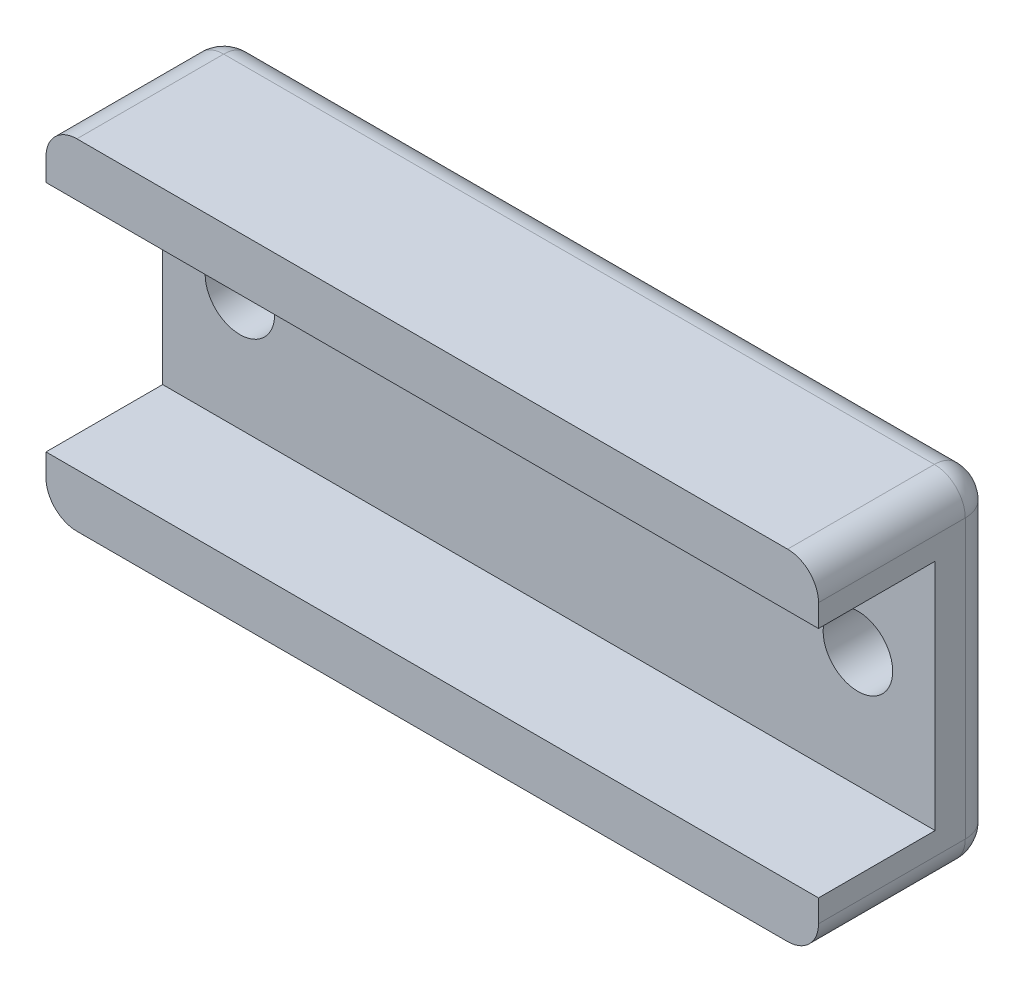
ISO-10303-21;
HEADER;
FILE_DESCRIPTION(('STEP AP214'),'2;1');
FILE_NAME('part.step','',(''),(''),'','','');
FILE_SCHEMA(('AUTOMOTIVE_DESIGN { 1 0 10303 214 1 1 1 1 }'));
ENDSEC;
DATA;
#1=APPLICATION_CONTEXT('core data for automotive mechanical design processes');
#2=APPLICATION_PROTOCOL_DEFINITION('international standard','automotive_design',2000,#1);
#3=PRODUCT_CONTEXT('',#1,'mechanical');
#4=PRODUCT('Part','Part','',(#3));
#5=PRODUCT_RELATED_PRODUCT_CATEGORY('part','',(#4));
#6=PRODUCT_DEFINITION_FORMATION('','',#4);
#7=PRODUCT_DEFINITION_CONTEXT('part definition',#1,'design');
#8=PRODUCT_DEFINITION('design','',#6,#7);
#9=PRODUCT_DEFINITION_SHAPE('','',#8);
#10=(LENGTH_UNIT() NAMED_UNIT(*) SI_UNIT(.MILLI.,.METRE.));
#11=(NAMED_UNIT(*) PLANE_ANGLE_UNIT() SI_UNIT($,.RADIAN.));
#12=(NAMED_UNIT(*) SI_UNIT($,.STERADIAN.) SOLID_ANGLE_UNIT());
#13=UNCERTAINTY_MEASURE_WITH_UNIT(LENGTH_MEASURE(1.E-05),#10,'distance_accuracy_value','');
#14=(GEOMETRIC_REPRESENTATION_CONTEXT(3) GLOBAL_UNCERTAINTY_ASSIGNED_CONTEXT((#13)) GLOBAL_UNIT_ASSIGNED_CONTEXT((#10,
#11,#12)) REPRESENTATION_CONTEXT('',''));
#15=CARTESIAN_POINT('',(0.,0.,0.));
#16=DIRECTION('',(0.,0.,1.));
#17=DIRECTION('',(1.,0.,0.));
#18=AXIS2_PLACEMENT_3D('',#15,#16,#17);
#19=CARTESIAN_POINT('',(0.,0.,23.));
#20=DIRECTION('',(1.,0.,0.));
#21=DIRECTION('',(0.,1.,0.));
#22=AXIS2_PLACEMENT_3D('',#19,#20,#21);
#23=PLANE('',#22);
#24=DIRECTION('',(0.,-1.,0.));
#25=VECTOR('',#24,1.);
#26=CARTESIAN_POINT('',(0.,0.,2.));
#27=LINE('',#26,#25);
#28=CARTESIAN_POINT('',(0.,-2.,2.));
#29=VERTEX_POINT('',#28);
#30=CARTESIAN_POINT('',(0.,-20.,2.));
#31=VERTEX_POINT('',#30);
#32=EDGE_CURVE('E228',#29,#31,#27,.T.);
#33=ORIENTED_EDGE('',*,*,#32,.T.);
#34=DIRECTION('',(0.,0.,-1.));
#35=VECTOR('',#34,1.);
#36=CARTESIAN_POINT('',(0.,-20.,23.));
#37=LINE('',#36,#35);
#38=CARTESIAN_POINT('',(0.,-20.,11.5));
#39=VERTEX_POINT('',#38);
#40=EDGE_CURVE('E162',#31,#39,#37,.F.);
#41=ORIENTED_EDGE('',*,*,#40,.T.);
#42=DIRECTION('',(0.,-1.,0.));
#43=VECTOR('',#42,1.);
#44=CARTESIAN_POINT('',(0.,27.,11.5));
#45=LINE('',#44,#43);
#46=CARTESIAN_POINT('',(0.,-18.55,11.5));
#47=VERTEX_POINT('',#46);
#48=EDGE_CURVE('E147',#47,#39,#45,.T.);
#49=ORIENTED_EDGE('',*,*,#48,.F.);
#50=DIRECTION('',(0.,0.,-1.));
#51=VECTOR('',#50,1.);
#52=CARTESIAN_POINT('',(0.,-18.55,23.));
#53=LINE('',#52,#51);
#54=CARTESIAN_POINT('',(0.,-18.55,3.95));
#55=VERTEX_POINT('',#54);
#56=EDGE_CURVE('E159',#47,#55,#53,.T.);
#57=ORIENTED_EDGE('',*,*,#56,.T.);
#58=DIRECTION('',(0.,-1.,0.));
#59=VECTOR('',#58,1.);
#60=CARTESIAN_POINT('',(0.,0.,3.95));
#61=LINE('',#60,#59);
#62=CARTESIAN_POINT('',(0.,-3.45,3.95));
#63=VERTEX_POINT('',#62);
#64=EDGE_CURVE('E176',#63,#55,#61,.T.);
#65=ORIENTED_EDGE('',*,*,#64,.F.);
#66=DIRECTION('',(0.,0.,-1.));
#67=VECTOR('',#66,1.);
#68=CARTESIAN_POINT('',(0.,-3.45,23.));
#69=LINE('',#68,#67);
#70=CARTESIAN_POINT('',(0.,-3.45,11.5));
#71=VERTEX_POINT('',#70);
#72=EDGE_CURVE('E171',#71,#63,#69,.T.);
#73=ORIENTED_EDGE('',*,*,#72,.F.);
#74=CARTESIAN_POINT('',(0.,-2.,11.5));
#75=VERTEX_POINT('',#74);
#76=EDGE_CURVE('E163',#75,#71,#45,.T.);
#77=ORIENTED_EDGE('',*,*,#76,.F.);
#78=DIRECTION('',(0.,0.,-1.));
#79=VECTOR('',#78,1.);
#80=CARTESIAN_POINT('',(0.,-2.,23.));
#81=LINE('',#80,#79);
#82=EDGE_CURVE('E226',#75,#29,#81,.T.);
#83=ORIENTED_EDGE('',*,*,#82,.T.);
#84=EDGE_LOOP('',(#33,#41,#49,#57,#65,#73,#77,#83));
#85=FACE_BOUND('',#84,.T.);
#86=ADVANCED_FACE('F40',(#85),#23,.F.);
#87=CARTESIAN_POINT('',(0.,-22.,23.));
#88=DIRECTION('',(0.,1.,0.));
#89=DIRECTION('',(0.,0.,1.));
#90=AXIS2_PLACEMENT_3D('',#87,#88,#89);
#91=PLANE('',#90);
#92=DIRECTION('',(1.,0.,0.));
#93=VECTOR('',#92,1.);
#94=CARTESIAN_POINT('',(0.,-22.,2.));
#95=LINE('',#94,#93);
#96=CARTESIAN_POINT('',(2.,-22.,2.));
#97=VERTEX_POINT('',#96);
#98=CARTESIAN_POINT('',(48.,-22.,2.));
#99=VERTEX_POINT('',#98);
#100=EDGE_CURVE('E195',#97,#99,#95,.T.);
#101=ORIENTED_EDGE('',*,*,#100,.T.);
#102=DIRECTION('',(0.,0.,-1.));
#103=VECTOR('',#102,1.);
#104=CARTESIAN_POINT('',(48.,-22.,23.));
#105=LINE('',#104,#103);
#106=CARTESIAN_POINT('',(48.,-22.,11.5));
#107=VERTEX_POINT('',#106);
#108=EDGE_CURVE('E208',#99,#107,#105,.F.);
#109=ORIENTED_EDGE('',*,*,#108,.T.);
#110=DIRECTION('',(1.,0.,0.));
#111=VECTOR('',#110,1.);
#112=CARTESIAN_POINT('',(0.,-22.,11.5));
#113=LINE('',#112,#111);
#114=CARTESIAN_POINT('',(2.,-22.,11.5));
#115=VERTEX_POINT('',#114);
#116=EDGE_CURVE('E164',#115,#107,#113,.T.);
#117=ORIENTED_EDGE('',*,*,#116,.F.);
#118=DIRECTION('',(0.,0.,-1.));
#119=VECTOR('',#118,1.);
#120=CARTESIAN_POINT('',(2.,-22.,23.));
#121=LINE('',#120,#119);
#122=EDGE_CURVE('E205',#115,#97,#121,.T.);
#123=ORIENTED_EDGE('',*,*,#122,.T.);
#124=EDGE_LOOP('',(#101,#109,#117,#123));
#125=FACE_BOUND('',#124,.T.);
#126=ADVANCED_FACE('F325',(#125),#91,.F.);
#127=CARTESIAN_POINT('',(50.,0.,23.));
#128=DIRECTION('',(-1.,0.,0.));
#129=DIRECTION('',(0.,0.,1.));
#130=AXIS2_PLACEMENT_3D('',#127,#128,#129);
#131=PLANE('',#130);
#132=DIRECTION('',(0.,-1.,0.));
#133=VECTOR('',#132,1.);
#134=CARTESIAN_POINT('',(50.,27.,11.5));
#135=LINE('',#134,#133);
#136=CARTESIAN_POINT('',(50.,-18.55,11.5));
#137=VERTEX_POINT('',#136);
#138=CARTESIAN_POINT('',(50.,-20.,11.5));
#139=VERTEX_POINT('',#138);
#140=EDGE_CURVE('E150',#137,#139,#135,.T.);
#141=ORIENTED_EDGE('',*,*,#140,.T.);
#142=DIRECTION('',(0.,0.,-1.));
#143=VECTOR('',#142,1.);
#144=CARTESIAN_POINT('',(50.,-20.,23.));
#145=LINE('',#144,#143);
#146=CARTESIAN_POINT('',(50.,-20.,2.));
#147=VERTEX_POINT('',#146);
#148=EDGE_CURVE('E202',#139,#147,#145,.T.);
#149=ORIENTED_EDGE('',*,*,#148,.T.);
#150=DIRECTION('',(0.,1.,0.));
#151=VECTOR('',#150,1.);
#152=CARTESIAN_POINT('',(50.,0.,2.));
#153=LINE('',#152,#151);
#154=CARTESIAN_POINT('',(50.,-2.,2.));
#155=VERTEX_POINT('',#154);
#156=EDGE_CURVE('E200',#147,#155,#153,.T.);
#157=ORIENTED_EDGE('',*,*,#156,.T.);
#158=DIRECTION('',(0.,0.,-1.));
#159=VECTOR('',#158,1.);
#160=CARTESIAN_POINT('',(50.,-2.,23.));
#161=LINE('',#160,#159);
#162=CARTESIAN_POINT('',(50.,-2.,11.5));
#163=VERTEX_POINT('',#162);
#164=EDGE_CURVE('E198',#155,#163,#161,.F.);
#165=ORIENTED_EDGE('',*,*,#164,.T.);
#166=CARTESIAN_POINT('',(50.,-3.45,11.5));
#167=VERTEX_POINT('',#166);
#168=EDGE_CURVE('E155',#163,#167,#135,.T.);
#169=ORIENTED_EDGE('',*,*,#168,.T.);
#170=DIRECTION('',(0.,0.,-1.));
#171=VECTOR('',#170,1.);
#172=CARTESIAN_POINT('',(50.,-3.45,19.05));
#173=LINE('',#172,#171);
#174=CARTESIAN_POINT('',(50.,-3.45,3.95));
#175=VERTEX_POINT('',#174);
#176=EDGE_CURVE('E281',#167,#175,#173,.T.);
#177=ORIENTED_EDGE('',*,*,#176,.T.);
#178=DIRECTION('',(0.,-1.,0.));
#179=VECTOR('',#178,1.);
#180=CARTESIAN_POINT('',(50.,-3.45,3.95));
#181=LINE('',#180,#179);
#182=CARTESIAN_POINT('',(50.,-18.55,3.95));
#183=VERTEX_POINT('',#182);
#184=EDGE_CURVE('E278',#175,#183,#181,.T.);
#185=ORIENTED_EDGE('',*,*,#184,.T.);
#186=DIRECTION('',(0.,0.,-1.));
#187=VECTOR('',#186,1.);
#188=CARTESIAN_POINT('',(50.,-18.55,19.05));
#189=LINE('',#188,#187);
#190=EDGE_CURVE('E186',#137,#183,#189,.T.);
#191=ORIENTED_EDGE('',*,*,#190,.F.);
#192=EDGE_LOOP('',(#141,#149,#157,#165,#169,#177,#185,#191));
#193=FACE_BOUND('',#192,.T.);
#194=ADVANCED_FACE('F332',(#193),#131,.F.);
#195=CARTESIAN_POINT('',(0.,0.,23.));
#196=DIRECTION('',(0.,-1.,0.));
#197=DIRECTION('',(0.,0.,-1.));
#198=AXIS2_PLACEMENT_3D('',#195,#196,#197);
#199=PLANE('',#198);
#200=DIRECTION('',(1.,0.,0.));
#201=VECTOR('',#200,1.);
#202=CARTESIAN_POINT('',(0.,0.,11.5));
#203=LINE('',#202,#201);
#204=CARTESIAN_POINT('',(2.,0.,11.5));
#205=VERTEX_POINT('',#204);
#206=CARTESIAN_POINT('',(48.,0.,11.5));
#207=VERTEX_POINT('',#206);
#208=EDGE_CURVE('E154',#205,#207,#203,.T.);
#209=ORIENTED_EDGE('',*,*,#208,.T.);
#210=DIRECTION('',(0.,0.,-1.));
#211=VECTOR('',#210,1.);
#212=CARTESIAN_POINT('',(48.,0.,23.));
#213=LINE('',#212,#211);
#214=CARTESIAN_POINT('',(48.,0.,2.));
#215=VERTEX_POINT('',#214);
#216=EDGE_CURVE('E232',#207,#215,#213,.T.);
#217=ORIENTED_EDGE('',*,*,#216,.T.);
#218=DIRECTION('',(-1.,0.,0.));
#219=VECTOR('',#218,1.);
#220=CARTESIAN_POINT('',(0.,0.,2.));
#221=LINE('',#220,#219);
#222=CARTESIAN_POINT('',(2.,0.,2.));
#223=VERTEX_POINT('',#222);
#224=EDGE_CURVE('E174',#215,#223,#221,.T.);
#225=ORIENTED_EDGE('',*,*,#224,.T.);
#226=DIRECTION('',(0.,0.,-1.));
#227=VECTOR('',#226,1.);
#228=CARTESIAN_POINT('',(2.,0.,23.));
#229=LINE('',#228,#227);
#230=EDGE_CURVE('E62',#223,#205,#229,.F.);
#231=ORIENTED_EDGE('',*,*,#230,.T.);
#232=EDGE_LOOP('',(#209,#217,#225,#231));
#233=FACE_BOUND('',#232,.T.);
#234=ADVANCED_FACE('F301',(#233),#199,.F.);
#235=CARTESIAN_POINT('',(0.,0.,0.));
#236=DIRECTION('',(0.,0.,1.));
#237=DIRECTION('',(1.,0.,0.));
#238=AXIS2_PLACEMENT_3D('',#235,#236,#237);
#239=PLANE('',#238);
#240=CARTESIAN_POINT('',(45.,-11.,0.));
#241=DIRECTION('',(0.,0.,-1.));
#242=DIRECTION('',(-1.,0.,0.));
#243=AXIS2_PLACEMENT_3D('',#240,#241,#242);
#244=CIRCLE('',#243,2.25);
#245=CARTESIAN_POINT('',(42.75,-11.,0.));
#246=VERTEX_POINT('',#245);
#247=EDGE_CURVE('E184',#246,#246,#244,.T.);
#248=ORIENTED_EDGE('',*,*,#247,.F.);
#249=EDGE_LOOP('',(#248));
#250=FACE_BOUND('',#249,.T.);
#251=CARTESIAN_POINT('',(5.,-11.,0.));
#252=DIRECTION('',(0.,0.,-1.));
#253=DIRECTION('',(-1.,0.,0.));
#254=AXIS2_PLACEMENT_3D('',#251,#252,#253);
#255=CIRCLE('',#254,2.25);
#256=CARTESIAN_POINT('',(2.75,-11.,0.));
#257=VERTEX_POINT('',#256);
#258=EDGE_CURVE('E272',#257,#257,#255,.T.);
#259=ORIENTED_EDGE('',*,*,#258,.F.);
#260=EDGE_LOOP('',(#259));
#261=FACE_BOUND('',#260,.T.);
#262=DIRECTION('',(-1.,0.,0.));
#263=VECTOR('',#262,1.);
#264=CARTESIAN_POINT('',(0.,-2.,0.));
#265=LINE('',#264,#263);
#266=CARTESIAN_POINT('',(2.,-2.,0.));
#267=VERTEX_POINT('',#266);
#268=CARTESIAN_POINT('',(48.,-2.,0.));
#269=VERTEX_POINT('',#268);
#270=EDGE_CURVE('E192',#267,#269,#265,.F.);
#271=ORIENTED_EDGE('',*,*,#270,.T.);
#272=DIRECTION('',(0.,1.,0.));
#273=VECTOR('',#272,1.);
#274=CARTESIAN_POINT('',(48.,0.,0.));
#275=LINE('',#274,#273);
#276=CARTESIAN_POINT('',(48.,-20.,0.));
#277=VERTEX_POINT('',#276);
#278=EDGE_CURVE('E220',#269,#277,#275,.F.);
#279=ORIENTED_EDGE('',*,*,#278,.T.);
#280=DIRECTION('',(1.,0.,0.));
#281=VECTOR('',#280,1.);
#282=CARTESIAN_POINT('',(0.,-20.,0.));
#283=LINE('',#282,#281);
#284=CARTESIAN_POINT('',(2.,-20.,0.));
#285=VERTEX_POINT('',#284);
#286=EDGE_CURVE('E189',#277,#285,#283,.F.);
#287=ORIENTED_EDGE('',*,*,#286,.T.);
#288=DIRECTION('',(0.,-1.,0.));
#289=VECTOR('',#288,1.);
#290=CARTESIAN_POINT('',(2.,0.,0.));
#291=LINE('',#290,#289);
#292=EDGE_CURVE('E218',#285,#267,#291,.F.);
#293=ORIENTED_EDGE('',*,*,#292,.T.);
#294=EDGE_LOOP('',(#271,#279,#287,#293));
#295=FACE_BOUND('',#294,.T.);
#296=ADVANCED_FACE('F307',(#250,#261,#295),#239,.F.);
#297=CARTESIAN_POINT('',(-27.,-18.55,19.05));
#298=DIRECTION('',(0.,-1.,0.));
#299=DIRECTION('',(0.,0.,-1.));
#300=AXIS2_PLACEMENT_3D('',#297,#298,#299);
#301=PLANE('',#300);
#302=ORIENTED_EDGE('',*,*,#56,.F.);
#303=DIRECTION('',(1.,0.,0.));
#304=VECTOR('',#303,1.);
#305=CARTESIAN_POINT('',(-27.,-18.55,11.5));
#306=LINE('',#305,#304);
#307=EDGE_CURVE('E143',#47,#137,#306,.T.);
#308=ORIENTED_EDGE('',*,*,#307,.T.);
#309=ORIENTED_EDGE('',*,*,#190,.T.);
#310=DIRECTION('',(1.,0.,0.));
#311=VECTOR('',#310,1.);
#312=CARTESIAN_POINT('',(-27.,-18.55,3.95));
#313=LINE('',#312,#311);
#314=EDGE_CURVE('E169',#55,#183,#313,.T.);
#315=ORIENTED_EDGE('',*,*,#314,.F.);
#316=EDGE_LOOP('',(#302,#308,#309,#315));
#317=FACE_BOUND('',#316,.T.);
#318=ADVANCED_FACE('F167',(#317),#301,.F.);
#319=CARTESIAN_POINT('',(-27.,-3.45,19.05));
#320=DIRECTION('',(0.,-1.,0.));
#321=DIRECTION('',(0.,0.,-1.));
#322=AXIS2_PLACEMENT_3D('',#319,#320,#321);
#323=PLANE('',#322);
#324=DIRECTION('',(1.,0.,0.));
#325=VECTOR('',#324,1.);
#326=CARTESIAN_POINT('',(-27.,-3.45,11.5));
#327=LINE('',#326,#325);
#328=EDGE_CURVE('E170',#71,#167,#327,.T.);
#329=ORIENTED_EDGE('',*,*,#328,.F.);
#330=ORIENTED_EDGE('',*,*,#72,.T.);
#331=DIRECTION('',(1.,0.,0.));
#332=VECTOR('',#331,1.);
#333=CARTESIAN_POINT('',(-27.,-3.45,3.95));
#334=LINE('',#333,#332);
#335=EDGE_CURVE('E283',#63,#175,#334,.T.);
#336=ORIENTED_EDGE('',*,*,#335,.T.);
#337=ORIENTED_EDGE('',*,*,#176,.F.);
#338=EDGE_LOOP('',(#329,#330,#336,#337));
#339=FACE_BOUND('',#338,.T.);
#340=ADVANCED_FACE('F292',(#339),#323,.T.);
#341=CARTESIAN_POINT('',(-27.,-3.45,3.95));
#342=DIRECTION('',(0.,0.,1.));
#343=DIRECTION('',(0.,-1.,0.));
#344=AXIS2_PLACEMENT_3D('',#341,#342,#343);
#345=PLANE('',#344);
#346=CARTESIAN_POINT('',(45.,-11.,3.95));
#347=DIRECTION('',(0.,0.,1.));
#348=DIRECTION('',(0.,-1.,0.));
#349=AXIS2_PLACEMENT_3D('',#346,#347,#348);
#350=CIRCLE('',#349,2.25);
#351=CARTESIAN_POINT('',(45.,-13.25,3.95));
#352=VERTEX_POINT('',#351);
#353=EDGE_CURVE('E183',#352,#352,#350,.T.);
#354=ORIENTED_EDGE('',*,*,#353,.F.);
#355=EDGE_LOOP('',(#354));
#356=FACE_BOUND('',#355,.T.);
#357=CARTESIAN_POINT('',(5.,-11.,3.95));
#358=DIRECTION('',(0.,0.,1.));
#359=DIRECTION('',(0.,-1.,0.));
#360=AXIS2_PLACEMENT_3D('',#357,#358,#359);
#361=CIRCLE('',#360,2.25);
#362=CARTESIAN_POINT('',(5.,-13.25,3.95));
#363=VERTEX_POINT('',#362);
#364=EDGE_CURVE('E180',#363,#363,#361,.T.);
#365=ORIENTED_EDGE('',*,*,#364,.F.);
#366=EDGE_LOOP('',(#365));
#367=FACE_BOUND('',#366,.T.);
#368=ORIENTED_EDGE('',*,*,#64,.T.);
#369=ORIENTED_EDGE('',*,*,#314,.T.);
#370=ORIENTED_EDGE('',*,*,#184,.F.);
#371=ORIENTED_EDGE('',*,*,#335,.F.);
#372=EDGE_LOOP('',(#368,#369,#370,#371));
#373=FACE_BOUND('',#372,.T.);
#374=ADVANCED_FACE('F288',(#356,#367,#373),#345,.T.);
#375=CARTESIAN_POINT('',(5.,-11.,49.));
#376=DIRECTION('',(0.,0.,-1.));
#377=DIRECTION('',(-1.,0.,0.));
#378=AXIS2_PLACEMENT_3D('',#375,#376,#377);
#379=CYLINDRICAL_SURFACE('',#378,2.25);
#380=ORIENTED_EDGE('',*,*,#364,.T.);
#381=EDGE_LOOP('',(#380));
#382=FACE_BOUND('',#381,.T.);
#383=ORIENTED_EDGE('',*,*,#258,.T.);
#384=EDGE_LOOP('',(#383));
#385=FACE_BOUND('',#384,.T.);
#386=ADVANCED_FACE('F423',(#382,#385),#379,.F.);
#387=CARTESIAN_POINT('',(45.,-11.,49.));
#388=DIRECTION('',(0.,0.,-1.));
#389=DIRECTION('',(-1.,0.,0.));
#390=AXIS2_PLACEMENT_3D('',#387,#388,#389);
#391=CYLINDRICAL_SURFACE('',#390,2.25);
#392=ORIENTED_EDGE('',*,*,#353,.T.);
#393=EDGE_LOOP('',(#392));
#394=FACE_BOUND('',#393,.T.);
#395=ORIENTED_EDGE('',*,*,#247,.T.);
#396=EDGE_LOOP('',(#395));
#397=FACE_BOUND('',#396,.T.);
#398=ADVANCED_FACE('F416',(#394,#397),#391,.F.);
#399=CARTESIAN_POINT('',(0.,27.,11.5));
#400=DIRECTION('',(0.,0.,-1.));
#401=DIRECTION('',(-1.,0.,0.));
#402=AXIS2_PLACEMENT_3D('',#399,#400,#401);
#403=PLANE('',#402);
#404=ORIENTED_EDGE('',*,*,#168,.F.);
#405=CARTESIAN_POINT('',(48.,-2.,11.5));
#406=DIRECTION('',(0.,0.,-1.));
#407=DIRECTION('',(-1.,0.,0.));
#408=AXIS2_PLACEMENT_3D('',#405,#406,#407);
#409=CIRCLE('',#408,2.);
#410=EDGE_CURVE('E11',#163,#207,#409,.F.);
#411=ORIENTED_EDGE('',*,*,#410,.T.);
#412=ORIENTED_EDGE('',*,*,#208,.F.);
#413=CARTESIAN_POINT('',(2.,-2.,11.5));
#414=DIRECTION('',(0.,0.,-1.));
#415=DIRECTION('',(-1.,0.,0.));
#416=AXIS2_PLACEMENT_3D('',#413,#414,#415);
#417=CIRCLE('',#416,2.);
#418=EDGE_CURVE('E49',#205,#75,#417,.F.);
#419=ORIENTED_EDGE('',*,*,#418,.T.);
#420=ORIENTED_EDGE('',*,*,#76,.T.);
#421=ORIENTED_EDGE('',*,*,#328,.T.);
#422=EDGE_LOOP('',(#404,#411,#412,#419,#420,#421));
#423=FACE_BOUND('',#422,.T.);
#424=ADVANCED_FACE('F265',(#423),#403,.F.);
#425=ORIENTED_EDGE('',*,*,#116,.T.);
#426=CARTESIAN_POINT('',(48.,-20.,11.5));
#427=DIRECTION('',(0.,0.,-1.));
#428=DIRECTION('',(-1.,0.,0.));
#429=AXIS2_PLACEMENT_3D('',#426,#427,#428);
#430=CIRCLE('',#429,2.);
#431=EDGE_CURVE('E212',#107,#139,#430,.F.);
#432=ORIENTED_EDGE('',*,*,#431,.T.);
#433=ORIENTED_EDGE('',*,*,#140,.F.);
#434=ORIENTED_EDGE('',*,*,#307,.F.);
#435=ORIENTED_EDGE('',*,*,#48,.T.);
#436=CARTESIAN_POINT('',(2.,-20.,11.5));
#437=DIRECTION('',(0.,0.,-1.));
#438=DIRECTION('',(-1.,0.,0.));
#439=AXIS2_PLACEMENT_3D('',#436,#437,#438);
#440=CIRCLE('',#439,2.);
#441=EDGE_CURVE('E210',#39,#115,#440,.F.);
#442=ORIENTED_EDGE('',*,*,#441,.T.);
#443=EDGE_LOOP('',(#425,#432,#433,#434,#435,#442));
#444=FACE_BOUND('',#443,.T.);
#445=ADVANCED_FACE('F146',(#444),#403,.F.);
#446=CARTESIAN_POINT('',(0.,-2.,2.));
#447=DIRECTION('',(-1.,0.,0.));
#448=DIRECTION('',(0.,0.,1.));
#449=AXIS2_PLACEMENT_3D('',#446,#447,#448);
#450=CYLINDRICAL_SURFACE('',#449,2.);
#451=ORIENTED_EDGE('',*,*,#224,.F.);
#452=CARTESIAN_POINT('',(48.,-2.,2.));
#453=DIRECTION('',(-1.,0.,0.));
#454=DIRECTION('',(0.,0.,1.));
#455=AXIS2_PLACEMENT_3D('',#452,#453,#454);
#456=CIRCLE('',#455,2.);
#457=EDGE_CURVE('E224',#215,#269,#456,.T.);
#458=ORIENTED_EDGE('',*,*,#457,.T.);
#459=ORIENTED_EDGE('',*,*,#270,.F.);
#460=CARTESIAN_POINT('',(2.,-2.,2.));
#461=DIRECTION('',(-1.,0.,0.));
#462=DIRECTION('',(0.,0.,1.));
#463=AXIS2_PLACEMENT_3D('',#460,#461,#462);
#464=CIRCLE('',#463,2.);
#465=EDGE_CURVE('E222',#267,#223,#464,.F.);
#466=ORIENTED_EDGE('',*,*,#465,.T.);
#467=EDGE_LOOP('',(#451,#458,#459,#466));
#468=FACE_BOUND('',#467,.T.);
#469=ADVANCED_FACE('F303',(#468),#450,.T.);
#470=CARTESIAN_POINT('',(0.,-20.,2.));
#471=DIRECTION('',(1.,0.,0.));
#472=DIRECTION('',(0.,0.,-1.));
#473=AXIS2_PLACEMENT_3D('',#470,#471,#472);
#474=CYLINDRICAL_SURFACE('',#473,2.);
#475=ORIENTED_EDGE('',*,*,#286,.F.);
#476=CARTESIAN_POINT('',(48.,-20.,2.));
#477=DIRECTION('',(1.,0.,0.));
#478=DIRECTION('',(0.,0.,-1.));
#479=AXIS2_PLACEMENT_3D('',#476,#477,#478);
#480=CIRCLE('',#479,2.);
#481=EDGE_CURVE('E216',#277,#99,#480,.F.);
#482=ORIENTED_EDGE('',*,*,#481,.T.);
#483=ORIENTED_EDGE('',*,*,#100,.F.);
#484=CARTESIAN_POINT('',(2.,-20.,2.));
#485=DIRECTION('',(1.,0.,0.));
#486=DIRECTION('',(0.,0.,-1.));
#487=AXIS2_PLACEMENT_3D('',#484,#485,#486);
#488=CIRCLE('',#487,2.);
#489=EDGE_CURVE('E214',#97,#285,#488,.T.);
#490=ORIENTED_EDGE('',*,*,#489,.T.);
#491=EDGE_LOOP('',(#475,#482,#483,#490));
#492=FACE_BOUND('',#491,.T.);
#493=ADVANCED_FACE('F322',(#492),#474,.T.);
#494=CARTESIAN_POINT('',(48.,-2.,23.));
#495=DIRECTION('',(0.,0.,-1.));
#496=DIRECTION('',(-1.,0.,0.));
#497=AXIS2_PLACEMENT_3D('',#494,#495,#496);
#498=CYLINDRICAL_SURFACE('',#497,2.);
#499=CARTESIAN_POINT('',(48.,-2.,2.));
#500=DIRECTION('',(0.,0.,-1.));
#501=DIRECTION('',(-1.,0.,0.));
#502=AXIS2_PLACEMENT_3D('',#499,#500,#501);
#503=CIRCLE('',#502,2.);
#504=EDGE_CURVE('E243',#215,#155,#503,.T.);
#505=ORIENTED_EDGE('',*,*,#504,.F.);
#506=ORIENTED_EDGE('',*,*,#216,.F.);
#507=ORIENTED_EDGE('',*,*,#410,.F.);
#508=ORIENTED_EDGE('',*,*,#164,.F.);
#509=EDGE_LOOP('',(#505,#506,#507,#508));
#510=FACE_BOUND('',#509,.T.);
#511=ADVANCED_FACE('F298',(#510),#498,.T.);
#512=CARTESIAN_POINT('',(48.,-2.,2.));
#513=DIRECTION('',(-1.,0.,0.));
#514=DIRECTION('',(0.,0.,1.));
#515=AXIS2_PLACEMENT_3D('',#512,#513,#514);
#516=SPHERICAL_SURFACE('',#515,2.);
#517=ORIENTED_EDGE('',*,*,#457,.F.);
#518=ORIENTED_EDGE('',*,*,#504,.T.);
#519=CARTESIAN_POINT('',(48.,-2.,2.));
#520=DIRECTION('',(0.,-1.,0.));
#521=DIRECTION('',(0.,0.,-1.));
#522=AXIS2_PLACEMENT_3D('',#519,#520,#521);
#523=CIRCLE('',#522,2.);
#524=EDGE_CURVE('E240',#269,#155,#523,.T.);
#525=ORIENTED_EDGE('',*,*,#524,.F.);
#526=EDGE_LOOP('',(#517,#518,#525));
#527=FACE_BOUND('',#526,.T.);
#528=ADVANCED_FACE('F311',(#527),#516,.T.);
#529=CARTESIAN_POINT('',(48.,0.,2.));
#530=DIRECTION('',(0.,1.,0.));
#531=DIRECTION('',(0.,0.,1.));
#532=AXIS2_PLACEMENT_3D('',#529,#530,#531);
#533=CYLINDRICAL_SURFACE('',#532,2.);
#534=CARTESIAN_POINT('',(48.,-20.,2.));
#535=DIRECTION('',(0.,-1.,0.));
#536=DIRECTION('',(0.,0.,-1.));
#537=AXIS2_PLACEMENT_3D('',#534,#535,#536);
#538=CIRCLE('',#537,2.);
#539=EDGE_CURVE('E237',#277,#147,#538,.T.);
#540=ORIENTED_EDGE('',*,*,#539,.F.);
#541=ORIENTED_EDGE('',*,*,#278,.F.);
#542=ORIENTED_EDGE('',*,*,#524,.T.);
#543=ORIENTED_EDGE('',*,*,#156,.F.);
#544=EDGE_LOOP('',(#540,#541,#542,#543));
#545=FACE_BOUND('',#544,.T.);
#546=ADVANCED_FACE('F315',(#545),#533,.T.);
#547=CARTESIAN_POINT('',(48.,-20.,2.));
#548=DIRECTION('',(-1.,0.,0.));
#549=DIRECTION('',(0.,0.,1.));
#550=AXIS2_PLACEMENT_3D('',#547,#548,#549);
#551=SPHERICAL_SURFACE('',#550,2.);
#552=ORIENTED_EDGE('',*,*,#481,.F.);
#553=ORIENTED_EDGE('',*,*,#539,.T.);
#554=CARTESIAN_POINT('',(48.,-20.,2.));
#555=DIRECTION('',(0.,0.,1.));
#556=DIRECTION('',(1.,0.,0.));
#557=AXIS2_PLACEMENT_3D('',#554,#555,#556);
#558=CIRCLE('',#557,2.);
#559=EDGE_CURVE('E235',#99,#147,#558,.T.);
#560=ORIENTED_EDGE('',*,*,#559,.F.);
#561=EDGE_LOOP('',(#552,#553,#560));
#562=FACE_BOUND('',#561,.T.);
#563=ADVANCED_FACE('F319',(#562),#551,.T.);
#564=CARTESIAN_POINT('',(48.,-20.,23.));
#565=DIRECTION('',(0.,0.,-1.));
#566=DIRECTION('',(-1.,0.,0.));
#567=AXIS2_PLACEMENT_3D('',#564,#565,#566);
#568=CYLINDRICAL_SURFACE('',#567,2.);
#569=ORIENTED_EDGE('',*,*,#431,.F.);
#570=ORIENTED_EDGE('',*,*,#108,.F.);
#571=ORIENTED_EDGE('',*,*,#559,.T.);
#572=ORIENTED_EDGE('',*,*,#148,.F.);
#573=EDGE_LOOP('',(#569,#570,#571,#572));
#574=FACE_BOUND('',#573,.T.);
#575=ADVANCED_FACE('F330',(#574),#568,.T.);
#576=CARTESIAN_POINT('',(2.,-2.,23.));
#577=DIRECTION('',(0.,0.,-1.));
#578=DIRECTION('',(-1.,0.,0.));
#579=AXIS2_PLACEMENT_3D('',#576,#577,#578);
#580=CYLINDRICAL_SURFACE('',#579,2.);
#581=ORIENTED_EDGE('',*,*,#418,.F.);
#582=ORIENTED_EDGE('',*,*,#230,.F.);
#583=CARTESIAN_POINT('',(2.,-2.,2.));
#584=DIRECTION('',(0.,0.,-1.));
#585=DIRECTION('',(-1.,0.,0.));
#586=AXIS2_PLACEMENT_3D('',#583,#584,#585);
#587=CIRCLE('',#586,2.);
#588=EDGE_CURVE('E44',#29,#223,#587,.T.);
#589=ORIENTED_EDGE('',*,*,#588,.F.);
#590=ORIENTED_EDGE('',*,*,#82,.F.);
#591=EDGE_LOOP('',(#581,#582,#589,#590));
#592=FACE_BOUND('',#591,.T.);
#593=ADVANCED_FACE('F42',(#592),#580,.T.);
#594=CARTESIAN_POINT('',(2.,-2.,2.));
#595=DIRECTION('',(1.,0.,0.));
#596=DIRECTION('',(0.,1.,0.));
#597=AXIS2_PLACEMENT_3D('',#594,#595,#596);
#598=SPHERICAL_SURFACE('',#597,2.);
#599=ORIENTED_EDGE('',*,*,#588,.T.);
#600=ORIENTED_EDGE('',*,*,#465,.F.);
#601=CARTESIAN_POINT('',(2.,-2.,2.));
#602=DIRECTION('',(0.,-1.,0.));
#603=DIRECTION('',(1.,0.,0.));
#604=AXIS2_PLACEMENT_3D('',#601,#602,#603);
#605=CIRCLE('',#604,2.);
#606=EDGE_CURVE('E250',#29,#267,#605,.T.);
#607=ORIENTED_EDGE('',*,*,#606,.F.);
#608=EDGE_LOOP('',(#599,#600,#607));
#609=FACE_BOUND('',#608,.T.);
#610=ADVANCED_FACE('F260',(#609),#598,.T.);
#611=CARTESIAN_POINT('',(2.,0.,2.));
#612=DIRECTION('',(0.,-1.,0.));
#613=DIRECTION('',(1.,0.,0.));
#614=AXIS2_PLACEMENT_3D('',#611,#612,#613);
#615=CYLINDRICAL_SURFACE('',#614,2.);
#616=ORIENTED_EDGE('',*,*,#606,.T.);
#617=ORIENTED_EDGE('',*,*,#292,.F.);
#618=CARTESIAN_POINT('',(2.,-20.,2.));
#619=DIRECTION('',(0.,-1.,0.));
#620=DIRECTION('',(0.,0.,-1.));
#621=AXIS2_PLACEMENT_3D('',#618,#619,#620);
#622=CIRCLE('',#621,2.);
#623=EDGE_CURVE('E248',#31,#285,#622,.T.);
#624=ORIENTED_EDGE('',*,*,#623,.F.);
#625=ORIENTED_EDGE('',*,*,#32,.F.);
#626=EDGE_LOOP('',(#616,#617,#624,#625));
#627=FACE_BOUND('',#626,.T.);
#628=ADVANCED_FACE('F367',(#627),#615,.T.);
#629=CARTESIAN_POINT('',(2.,-20.,2.));
#630=DIRECTION('',(1.,0.,0.));
#631=DIRECTION('',(0.,1.,0.));
#632=AXIS2_PLACEMENT_3D('',#629,#630,#631);
#633=SPHERICAL_SURFACE('',#632,2.);
#634=ORIENTED_EDGE('',*,*,#623,.T.);
#635=ORIENTED_EDGE('',*,*,#489,.F.);
#636=CARTESIAN_POINT('',(2.,-20.,2.));
#637=DIRECTION('',(0.,0.,1.));
#638=DIRECTION('',(1.,0.,0.));
#639=AXIS2_PLACEMENT_3D('',#636,#637,#638);
#640=CIRCLE('',#639,2.);
#641=EDGE_CURVE('E246',#31,#97,#640,.T.);
#642=ORIENTED_EDGE('',*,*,#641,.F.);
#643=EDGE_LOOP('',(#634,#635,#642));
#644=FACE_BOUND('',#643,.T.);
#645=ADVANCED_FACE('F363',(#644),#633,.T.);
#646=CARTESIAN_POINT('',(2.,-20.,23.));
#647=DIRECTION('',(0.,0.,-1.));
#648=DIRECTION('',(-1.,0.,0.));
#649=AXIS2_PLACEMENT_3D('',#646,#647,#648);
#650=CYLINDRICAL_SURFACE('',#649,2.);
#651=ORIENTED_EDGE('',*,*,#441,.F.);
#652=ORIENTED_EDGE('',*,*,#40,.F.);
#653=ORIENTED_EDGE('',*,*,#641,.T.);
#654=ORIENTED_EDGE('',*,*,#122,.F.);
#655=EDGE_LOOP('',(#651,#652,#653,#654));
#656=FACE_BOUND('',#655,.T.);
#657=ADVANCED_FACE('F360',(#656),#650,.T.);
#658=CLOSED_SHELL('',(#86,#126,#194,#234,#296,#318,#340,#374,#386,#398,#424,#445,#469,#493,#511,
#528,#546,#563,#575,#593,#610,#628,#645,#657));
#659=MANIFOLD_SOLID_BREP('B2',#658);
#660=ADVANCED_BREP_SHAPE_REPRESENTATION('',(#18,#659),#14);
#661=SHAPE_DEFINITION_REPRESENTATION(#9,#660);
ENDSEC;
END-ISO-10303-21;
